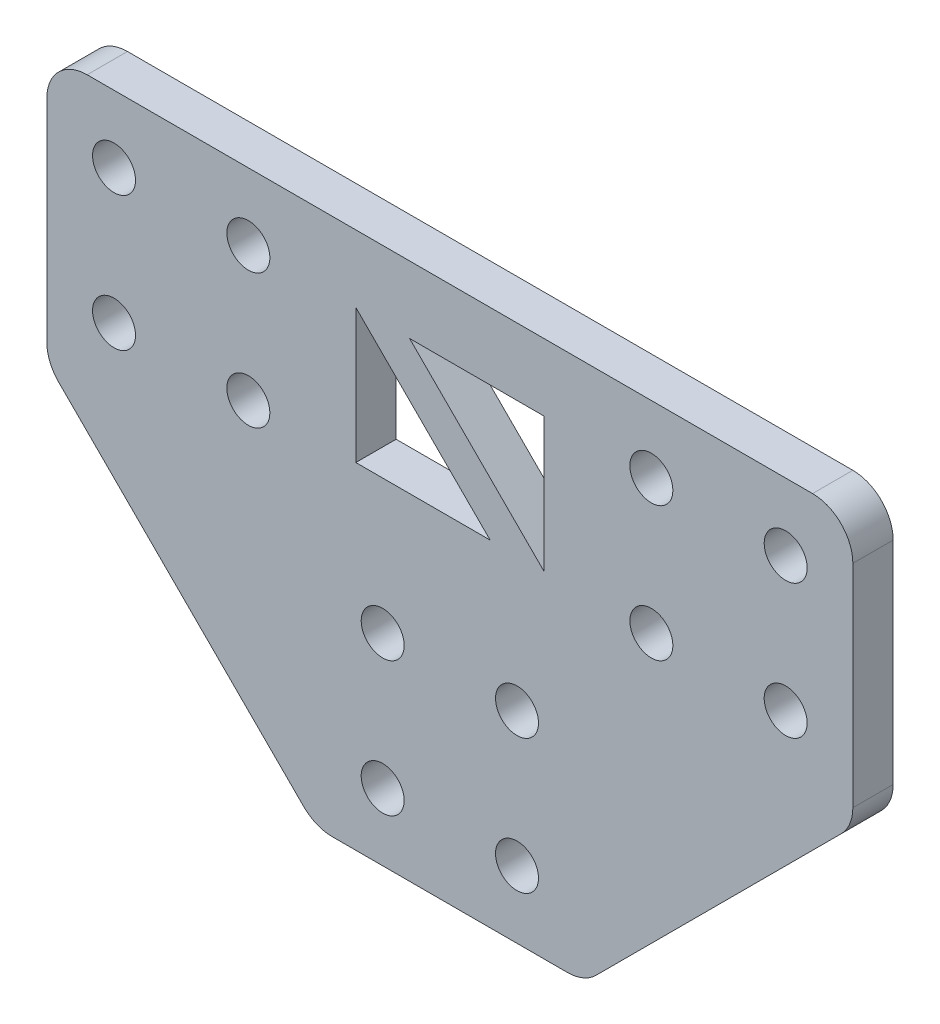
ISO-10303-21;
HEADER;
FILE_DESCRIPTION(('STEP AP214'),'2;1');
FILE_NAME('part.step','',(''),(''),'','','');
FILE_SCHEMA(('AUTOMOTIVE_DESIGN { 1 0 10303 214 1 1 1 1 }'));
ENDSEC;
DATA;
#1=APPLICATION_CONTEXT('core data for automotive mechanical design processes');
#2=APPLICATION_PROTOCOL_DEFINITION('international standard','automotive_design',2000,#1);
#3=PRODUCT_CONTEXT('',#1,'mechanical');
#4=PRODUCT('Part','Part','',(#3));
#5=PRODUCT_RELATED_PRODUCT_CATEGORY('part','',(#4));
#6=PRODUCT_DEFINITION_FORMATION('','',#4);
#7=PRODUCT_DEFINITION_CONTEXT('part definition',#1,'design');
#8=PRODUCT_DEFINITION('design','',#6,#7);
#9=PRODUCT_DEFINITION_SHAPE('','',#8);
#10=(LENGTH_UNIT() NAMED_UNIT(*) SI_UNIT(.MILLI.,.METRE.));
#11=(NAMED_UNIT(*) PLANE_ANGLE_UNIT() SI_UNIT($,.RADIAN.));
#12=(NAMED_UNIT(*) SI_UNIT($,.STERADIAN.) SOLID_ANGLE_UNIT());
#13=UNCERTAINTY_MEASURE_WITH_UNIT(LENGTH_MEASURE(1.E-05),#10,'distance_accuracy_value','');
#14=(GEOMETRIC_REPRESENTATION_CONTEXT(3) GLOBAL_UNCERTAINTY_ASSIGNED_CONTEXT((#13)) GLOBAL_UNIT_ASSIGNED_CONTEXT((#10,
#11,#12)) REPRESENTATION_CONTEXT('',''));
#15=CARTESIAN_POINT('',(0.,0.,0.));
#16=DIRECTION('',(0.,0.,1.));
#17=DIRECTION('',(1.,0.,0.));
#18=AXIS2_PLACEMENT_3D('',#15,#16,#17);
#19=CARTESIAN_POINT('',(0.,0.,3.));
#20=DIRECTION('',(0.,0.,-1.));
#21=DIRECTION('',(-1.,0.,0.));
#22=AXIS2_PLACEMENT_3D('',#19,#20,#21);
#23=PLANE('',#22);
#24=DIRECTION('',(-0.707106781186548,0.707106781186547,0.));
#25=VECTOR('',#24,1.);
#26=CARTESIAN_POINT('',(33.,-15.,3.));
#27=LINE('',#26,#25);
#28=CARTESIAN_POINT('',(33.,-15.,3.));
#29=VERTEX_POINT('',#28);
#30=CARTESIAN_POINT('',(23.,-5.,3.));
#31=VERTEX_POINT('',#30);
#32=EDGE_CURVE('E211',#29,#31,#27,.T.);
#33=ORIENTED_EDGE('',*,*,#32,.F.);
#34=DIRECTION('',(1.,0.,0.));
#35=VECTOR('',#34,1.);
#36=CARTESIAN_POINT('',(23.,-15.,3.));
#37=LINE('',#36,#35);
#38=CARTESIAN_POINT('',(23.,-15.,3.));
#39=VERTEX_POINT('',#38);
#40=EDGE_CURVE('E219',#39,#29,#37,.T.);
#41=ORIENTED_EDGE('',*,*,#40,.F.);
#42=DIRECTION('',(0.,-1.,0.));
#43=VECTOR('',#42,1.);
#44=CARTESIAN_POINT('',(23.,-5.,3.));
#45=LINE('',#44,#43);
#46=EDGE_CURVE('E214',#31,#39,#45,.T.);
#47=ORIENTED_EDGE('',*,*,#46,.F.);
#48=EDGE_LOOP('',(#33,#41,#47));
#49=FACE_BOUND('',#48,.T.);
#50=DIRECTION('',(0.707106781186547,0.707106781186548,0.));
#51=VECTOR('',#50,1.);
#52=CARTESIAN_POINT('',(60.,-20.,3.));
#53=LINE('',#52,#51);
#54=CARTESIAN_POINT('',(40.8786796564404,-39.1213203435596,3.));
#55=VERTEX_POINT('',#54);
#56=CARTESIAN_POINT('',(59.1213203435596,-20.8786796564404,3.));
#57=VERTEX_POINT('',#56);
#58=EDGE_CURVE('E353',#55,#57,#53,.T.);
#59=ORIENTED_EDGE('',*,*,#58,.T.);
#60=CARTESIAN_POINT('',(57.,-18.7573593128807,3.));
#61=DIRECTION('',(0.,0.,-1.));
#62=DIRECTION('',(-1.,0.,0.));
#63=AXIS2_PLACEMENT_3D('',#60,#61,#62);
#64=CIRCLE('',#63,3.);
#65=CARTESIAN_POINT('',(60.,-18.7573593128807,3.));
#66=VERTEX_POINT('',#65);
#67=EDGE_CURVE('E430',#57,#66,#64,.F.);
#68=ORIENTED_EDGE('',*,*,#67,.T.);
#69=DIRECTION('',(0.,1.,0.));
#70=VECTOR('',#69,1.);
#71=CARTESIAN_POINT('',(60.,0.,3.));
#72=LINE('',#71,#70);
#73=CARTESIAN_POINT('',(60.,-3.,3.));
#74=VERTEX_POINT('',#73);
#75=EDGE_CURVE('E357',#66,#74,#72,.T.);
#76=ORIENTED_EDGE('',*,*,#75,.T.);
#77=CARTESIAN_POINT('',(57.,-3.,3.));
#78=DIRECTION('',(0.,0.,-1.));
#79=DIRECTION('',(-1.,0.,0.));
#80=AXIS2_PLACEMENT_3D('',#77,#78,#79);
#81=CIRCLE('',#80,3.);
#82=CARTESIAN_POINT('',(57.,0.,3.));
#83=VERTEX_POINT('',#82);
#84=EDGE_CURVE('E64',#74,#83,#81,.F.);
#85=ORIENTED_EDGE('',*,*,#84,.T.);
#86=DIRECTION('',(-1.,0.,0.));
#87=VECTOR('',#86,1.);
#88=CARTESIAN_POINT('',(0.,0.,3.));
#89=LINE('',#88,#87);
#90=CARTESIAN_POINT('',(3.,0.,3.));
#91=VERTEX_POINT('',#90);
#92=EDGE_CURVE('E360',#83,#91,#89,.T.);
#93=ORIENTED_EDGE('',*,*,#92,.T.);
#94=CARTESIAN_POINT('',(3.,-3.,3.));
#95=DIRECTION('',(0.,0.,-1.));
#96=DIRECTION('',(-1.,0.,0.));
#97=AXIS2_PLACEMENT_3D('',#94,#95,#96);
#98=CIRCLE('',#97,3.);
#99=CARTESIAN_POINT('',(0.,-3.,3.));
#100=VERTEX_POINT('',#99);
#101=EDGE_CURVE('E416',#91,#100,#98,.F.);
#102=ORIENTED_EDGE('',*,*,#101,.T.);
#103=DIRECTION('',(0.,-1.,0.));
#104=VECTOR('',#103,1.);
#105=CARTESIAN_POINT('',(0.,-20.,3.));
#106=LINE('',#105,#104);
#107=CARTESIAN_POINT('',(0.,-18.7573593128807,3.));
#108=VERTEX_POINT('',#107);
#109=EDGE_CURVE('E340',#100,#108,#106,.T.);
#110=ORIENTED_EDGE('',*,*,#109,.T.);
#111=CARTESIAN_POINT('',(3.,-18.7573593128807,3.));
#112=DIRECTION('',(0.,0.,-1.));
#113=DIRECTION('',(-1.,0.,0.));
#114=AXIS2_PLACEMENT_3D('',#111,#112,#113);
#115=CIRCLE('',#114,3.);
#116=CARTESIAN_POINT('',(0.878679656440354,-20.8786796564404,3.));
#117=VERTEX_POINT('',#116);
#118=EDGE_CURVE('E427',#108,#117,#115,.F.);
#119=ORIENTED_EDGE('',*,*,#118,.T.);
#120=DIRECTION('',(0.707106781186548,-0.707106781186548,0.));
#121=VECTOR('',#120,1.);
#122=CARTESIAN_POINT('',(20.,-40.,3.));
#123=LINE('',#122,#121);
#124=CARTESIAN_POINT('',(19.1213203435596,-39.1213203435596,3.));
#125=VERTEX_POINT('',#124);
#126=EDGE_CURVE('E344',#117,#125,#123,.T.);
#127=ORIENTED_EDGE('',*,*,#126,.T.);
#128=CARTESIAN_POINT('',(21.2426406871193,-37.,3.));
#129=DIRECTION('',(0.,0.,-1.));
#130=DIRECTION('',(-1.,0.,0.));
#131=AXIS2_PLACEMENT_3D('',#128,#129,#130);
#132=CIRCLE('',#131,3.);
#133=CARTESIAN_POINT('',(21.2426406871193,-40.,3.));
#134=VERTEX_POINT('',#133);
#135=EDGE_CURVE('E424',#125,#134,#132,.F.);
#136=ORIENTED_EDGE('',*,*,#135,.T.);
#137=DIRECTION('',(1.,0.,0.));
#138=VECTOR('',#137,1.);
#139=CARTESIAN_POINT('',(40.,-40.,3.));
#140=LINE('',#139,#138);
#141=CARTESIAN_POINT('',(38.7573593128807,-40.,3.));
#142=VERTEX_POINT('',#141);
#143=EDGE_CURVE('E349',#134,#142,#140,.T.);
#144=ORIENTED_EDGE('',*,*,#143,.T.);
#145=CARTESIAN_POINT('',(38.7573593128807,-37.,3.));
#146=DIRECTION('',(0.,0.,-1.));
#147=DIRECTION('',(-1.,0.,0.));
#148=AXIS2_PLACEMENT_3D('',#145,#146,#147);
#149=CIRCLE('',#148,3.);
#150=EDGE_CURVE('E421',#142,#55,#149,.F.);
#151=ORIENTED_EDGE('',*,*,#150,.T.);
#152=EDGE_LOOP('',(#59,#68,#76,#85,#93,#102,#110,#119,#127,#136,#144,#151));
#153=FACE_BOUND('',#152,.T.);
#154=CARTESIAN_POINT('',(5.,-5.,3.));
#155=DIRECTION('',(0.,0.,1.));
#156=DIRECTION('',(1.,0.,0.));
#157=AXIS2_PLACEMENT_3D('',#154,#155,#156);
#158=CIRCLE('',#157,1.6);
#159=CARTESIAN_POINT('',(6.6,-5.,3.));
#160=VERTEX_POINT('',#159);
#161=EDGE_CURVE('E332',#160,#160,#158,.T.);
#162=ORIENTED_EDGE('',*,*,#161,.F.);
#163=EDGE_LOOP('',(#162));
#164=FACE_BOUND('',#163,.T.);
#165=CARTESIAN_POINT('',(15.,-5.,3.));
#166=DIRECTION('',(0.,0.,1.));
#167=DIRECTION('',(-1.,0.,0.));
#168=AXIS2_PLACEMENT_3D('',#165,#166,#167);
#169=CIRCLE('',#168,1.6);
#170=CARTESIAN_POINT('',(13.4,-5.,3.));
#171=VERTEX_POINT('',#170);
#172=EDGE_CURVE('E324',#171,#171,#169,.T.);
#173=ORIENTED_EDGE('',*,*,#172,.F.);
#174=EDGE_LOOP('',(#173));
#175=FACE_BOUND('',#174,.T.);
#176=CARTESIAN_POINT('',(15.,-15.,3.));
#177=DIRECTION('',(0.,0.,1.));
#178=DIRECTION('',(1.,0.,0.));
#179=AXIS2_PLACEMENT_3D('',#176,#177,#178);
#180=CIRCLE('',#179,1.6);
#181=CARTESIAN_POINT('',(16.6,-15.,3.));
#182=VERTEX_POINT('',#181);
#183=EDGE_CURVE('E316',#182,#182,#180,.T.);
#184=ORIENTED_EDGE('',*,*,#183,.F.);
#185=EDGE_LOOP('',(#184));
#186=FACE_BOUND('',#185,.T.);
#187=CARTESIAN_POINT('',(5.,-15.,3.));
#188=DIRECTION('',(0.,0.,1.));
#189=DIRECTION('',(-1.,0.,0.));
#190=AXIS2_PLACEMENT_3D('',#187,#188,#189);
#191=CIRCLE('',#190,1.6);
#192=CARTESIAN_POINT('',(3.4,-15.,3.));
#193=VERTEX_POINT('',#192);
#194=EDGE_CURVE('E308',#193,#193,#191,.T.);
#195=ORIENTED_EDGE('',*,*,#194,.F.);
#196=EDGE_LOOP('',(#195));
#197=FACE_BOUND('',#196,.T.);
#198=CARTESIAN_POINT('',(55.,-15.,3.));
#199=DIRECTION('',(0.,0.,1.));
#200=DIRECTION('',(1.,0.,0.));
#201=AXIS2_PLACEMENT_3D('',#198,#199,#200);
#202=CIRCLE('',#201,1.59999999999999);
#203=CARTESIAN_POINT('',(56.6,-15.,3.));
#204=VERTEX_POINT('',#203);
#205=EDGE_CURVE('E300',#204,#204,#202,.T.);
#206=ORIENTED_EDGE('',*,*,#205,.F.);
#207=EDGE_LOOP('',(#206));
#208=FACE_BOUND('',#207,.T.);
#209=CARTESIAN_POINT('',(45.,-15.,3.));
#210=DIRECTION('',(0.,0.,1.));
#211=DIRECTION('',(-1.,0.,0.));
#212=AXIS2_PLACEMENT_3D('',#209,#210,#211);
#213=CIRCLE('',#212,1.6);
#214=CARTESIAN_POINT('',(43.4,-15.,3.));
#215=VERTEX_POINT('',#214);
#216=EDGE_CURVE('E292',#215,#215,#213,.T.);
#217=ORIENTED_EDGE('',*,*,#216,.F.);
#218=EDGE_LOOP('',(#217));
#219=FACE_BOUND('',#218,.T.);
#220=CARTESIAN_POINT('',(45.,-4.99999999999999,3.));
#221=DIRECTION('',(0.,0.,1.));
#222=DIRECTION('',(1.,0.,0.));
#223=AXIS2_PLACEMENT_3D('',#220,#221,#222);
#224=CIRCLE('',#223,1.6);
#225=CARTESIAN_POINT('',(46.6,-4.99999999999999,3.));
#226=VERTEX_POINT('',#225);
#227=EDGE_CURVE('E284',#226,#226,#224,.T.);
#228=ORIENTED_EDGE('',*,*,#227,.F.);
#229=EDGE_LOOP('',(#228));
#230=FACE_BOUND('',#229,.T.);
#231=CARTESIAN_POINT('',(55.,-4.99999999999999,3.));
#232=DIRECTION('',(0.,0.,1.));
#233=DIRECTION('',(-1.,0.,0.));
#234=AXIS2_PLACEMENT_3D('',#231,#232,#233);
#235=CIRCLE('',#234,1.59999999999999);
#236=CARTESIAN_POINT('',(53.4,-4.99999999999999,3.));
#237=VERTEX_POINT('',#236);
#238=EDGE_CURVE('E276',#237,#237,#235,.T.);
#239=ORIENTED_EDGE('',*,*,#238,.F.);
#240=EDGE_LOOP('',(#239));
#241=FACE_BOUND('',#240,.T.);
#242=CARTESIAN_POINT('',(25.,-35.,3.));
#243=DIRECTION('',(0.,0.,1.));
#244=DIRECTION('',(1.,0.,0.));
#245=AXIS2_PLACEMENT_3D('',#242,#243,#244);
#246=CIRCLE('',#245,1.6);
#247=CARTESIAN_POINT('',(26.6,-35.,3.));
#248=VERTEX_POINT('',#247);
#249=EDGE_CURVE('E268',#248,#248,#246,.T.);
#250=ORIENTED_EDGE('',*,*,#249,.F.);
#251=EDGE_LOOP('',(#250));
#252=FACE_BOUND('',#251,.T.);
#253=CARTESIAN_POINT('',(35.,-35.,3.));
#254=DIRECTION('',(0.,0.,1.));
#255=DIRECTION('',(-1.,0.,0.));
#256=AXIS2_PLACEMENT_3D('',#253,#254,#255);
#257=CIRCLE('',#256,1.6);
#258=CARTESIAN_POINT('',(33.4,-35.,3.));
#259=VERTEX_POINT('',#258);
#260=EDGE_CURVE('E260',#259,#259,#257,.T.);
#261=ORIENTED_EDGE('',*,*,#260,.F.);
#262=EDGE_LOOP('',(#261));
#263=FACE_BOUND('',#262,.T.);
#264=CARTESIAN_POINT('',(35.,-25.,3.));
#265=DIRECTION('',(0.,0.,1.));
#266=DIRECTION('',(1.,0.,0.));
#267=AXIS2_PLACEMENT_3D('',#264,#265,#266);
#268=CIRCLE('',#267,1.6);
#269=CARTESIAN_POINT('',(36.6,-25.,3.));
#270=VERTEX_POINT('',#269);
#271=EDGE_CURVE('E252',#270,#270,#268,.T.);
#272=ORIENTED_EDGE('',*,*,#271,.F.);
#273=EDGE_LOOP('',(#272));
#274=FACE_BOUND('',#273,.T.);
#275=CARTESIAN_POINT('',(25.,-25.,3.));
#276=DIRECTION('',(0.,0.,1.));
#277=DIRECTION('',(-1.,0.,0.));
#278=AXIS2_PLACEMENT_3D('',#275,#276,#277);
#279=CIRCLE('',#278,1.6);
#280=CARTESIAN_POINT('',(23.4,-25.,3.));
#281=VERTEX_POINT('',#280);
#282=EDGE_CURVE('E244',#281,#281,#279,.T.);
#283=ORIENTED_EDGE('',*,*,#282,.F.);
#284=EDGE_LOOP('',(#283));
#285=FACE_BOUND('',#284,.T.);
#286=DIRECTION('',(0.707106781186547,-0.707106781186548,0.));
#287=VECTOR('',#286,1.);
#288=CARTESIAN_POINT('',(37.,-15.,3.));
#289=LINE('',#288,#287);
#290=CARTESIAN_POINT('',(27.,-5.,3.));
#291=VERTEX_POINT('',#290);
#292=CARTESIAN_POINT('',(37.,-15.,3.));
#293=VERTEX_POINT('',#292);
#294=EDGE_CURVE('E170',#291,#293,#289,.T.);
#295=ORIENTED_EDGE('',*,*,#294,.F.);
#296=DIRECTION('',(-1.,0.,0.));
#297=VECTOR('',#296,1.);
#298=CARTESIAN_POINT('',(27.,-5.,3.));
#299=LINE('',#298,#297);
#300=CARTESIAN_POINT('',(37.,-5.,3.));
#301=VERTEX_POINT('',#300);
#302=EDGE_CURVE('E193',#301,#291,#299,.T.);
#303=ORIENTED_EDGE('',*,*,#302,.F.);
#304=DIRECTION('',(0.,1.,0.));
#305=VECTOR('',#304,1.);
#306=CARTESIAN_POINT('',(37.,-5.,3.));
#307=LINE('',#306,#305);
#308=EDGE_CURVE('E181',#293,#301,#307,.T.);
#309=ORIENTED_EDGE('',*,*,#308,.F.);
#310=EDGE_LOOP('',(#295,#303,#309));
#311=FACE_BOUND('',#310,.T.);
#312=ADVANCED_FACE('F42',(#49,#153,#164,#175,#186,#197,#208,#219,#230,#241,#252,#263,#274,#285,
#311),#23,.F.);
#313=CARTESIAN_POINT('',(0.,0.,0.));
#314=DIRECTION('',(0.,0.,-1.));
#315=DIRECTION('',(-1.,0.,0.));
#316=AXIS2_PLACEMENT_3D('',#313,#314,#315);
#317=PLANE('',#316);
#318=CARTESIAN_POINT('',(35.,-25.,0.));
#319=DIRECTION('',(0.,0.,1.));
#320=DIRECTION('',(1.,0.,0.));
#321=AXIS2_PLACEMENT_3D('',#318,#319,#320);
#322=CIRCLE('',#321,1.6);
#323=CARTESIAN_POINT('',(36.6,-25.,0.));
#324=VERTEX_POINT('',#323);
#325=EDGE_CURVE('E248',#324,#324,#322,.T.);
#326=ORIENTED_EDGE('',*,*,#325,.T.);
#327=EDGE_LOOP('',(#326));
#328=FACE_BOUND('',#327,.T.);
#329=CARTESIAN_POINT('',(25.,-35.,0.));
#330=DIRECTION('',(0.,0.,1.));
#331=DIRECTION('',(1.,0.,0.));
#332=AXIS2_PLACEMENT_3D('',#329,#330,#331);
#333=CIRCLE('',#332,1.6);
#334=CARTESIAN_POINT('',(26.6,-35.,0.));
#335=VERTEX_POINT('',#334);
#336=EDGE_CURVE('E264',#335,#335,#333,.T.);
#337=ORIENTED_EDGE('',*,*,#336,.T.);
#338=EDGE_LOOP('',(#337));
#339=FACE_BOUND('',#338,.T.);
#340=CARTESIAN_POINT('',(45.,-4.99999999999999,0.));
#341=DIRECTION('',(0.,0.,1.));
#342=DIRECTION('',(1.,0.,0.));
#343=AXIS2_PLACEMENT_3D('',#340,#341,#342);
#344=CIRCLE('',#343,1.6);
#345=CARTESIAN_POINT('',(46.6,-4.99999999999999,0.));
#346=VERTEX_POINT('',#345);
#347=EDGE_CURVE('E280',#346,#346,#344,.T.);
#348=ORIENTED_EDGE('',*,*,#347,.T.);
#349=EDGE_LOOP('',(#348));
#350=FACE_BOUND('',#349,.T.);
#351=CARTESIAN_POINT('',(55.,-15.,0.));
#352=DIRECTION('',(0.,0.,1.));
#353=DIRECTION('',(1.,0.,0.));
#354=AXIS2_PLACEMENT_3D('',#351,#352,#353);
#355=CIRCLE('',#354,1.59999999999999);
#356=CARTESIAN_POINT('',(56.6,-15.,0.));
#357=VERTEX_POINT('',#356);
#358=EDGE_CURVE('E296',#357,#357,#355,.T.);
#359=ORIENTED_EDGE('',*,*,#358,.T.);
#360=EDGE_LOOP('',(#359));
#361=FACE_BOUND('',#360,.T.);
#362=CARTESIAN_POINT('',(15.,-15.,0.));
#363=DIRECTION('',(0.,0.,1.));
#364=DIRECTION('',(1.,0.,0.));
#365=AXIS2_PLACEMENT_3D('',#362,#363,#364);
#366=CIRCLE('',#365,1.6);
#367=CARTESIAN_POINT('',(16.6,-15.,0.));
#368=VERTEX_POINT('',#367);
#369=EDGE_CURVE('E312',#368,#368,#366,.T.);
#370=ORIENTED_EDGE('',*,*,#369,.T.);
#371=EDGE_LOOP('',(#370));
#372=FACE_BOUND('',#371,.T.);
#373=CARTESIAN_POINT('',(5.,-5.,0.));
#374=DIRECTION('',(0.,0.,1.));
#375=DIRECTION('',(1.,0.,0.));
#376=AXIS2_PLACEMENT_3D('',#373,#374,#375);
#377=CIRCLE('',#376,1.6);
#378=CARTESIAN_POINT('',(6.6,-5.,0.));
#379=VERTEX_POINT('',#378);
#380=EDGE_CURVE('E328',#379,#379,#377,.T.);
#381=ORIENTED_EDGE('',*,*,#380,.T.);
#382=EDGE_LOOP('',(#381));
#383=FACE_BOUND('',#382,.T.);
#384=DIRECTION('',(0.,1.,0.));
#385=VECTOR('',#384,1.);
#386=CARTESIAN_POINT('',(60.,0.,0.));
#387=LINE('',#386,#385);
#388=CARTESIAN_POINT('',(60.,-18.7573593128807,0.));
#389=VERTEX_POINT('',#388);
#390=CARTESIAN_POINT('',(60.,-3.,0.));
#391=VERTEX_POINT('',#390);
#392=EDGE_CURVE('E379',#389,#391,#387,.T.);
#393=ORIENTED_EDGE('',*,*,#392,.F.);
#394=CARTESIAN_POINT('',(57.,-18.7573593128807,0.));
#395=DIRECTION('',(0.,0.,-1.));
#396=DIRECTION('',(-1.,0.,0.));
#397=AXIS2_PLACEMENT_3D('',#394,#395,#396);
#398=CIRCLE('',#397,3.);
#399=CARTESIAN_POINT('',(59.1213203435596,-20.8786796564404,0.));
#400=VERTEX_POINT('',#399);
#401=EDGE_CURVE('E406',#389,#400,#398,.T.);
#402=ORIENTED_EDGE('',*,*,#401,.T.);
#403=DIRECTION('',(0.707106781186547,0.707106781186548,0.));
#404=VECTOR('',#403,1.);
#405=CARTESIAN_POINT('',(60.,-20.,0.));
#406=LINE('',#405,#404);
#407=CARTESIAN_POINT('',(40.8786796564404,-39.1213203435596,0.));
#408=VERTEX_POINT('',#407);
#409=EDGE_CURVE('E375',#408,#400,#406,.T.);
#410=ORIENTED_EDGE('',*,*,#409,.F.);
#411=CARTESIAN_POINT('',(38.7573593128807,-37.,0.));
#412=DIRECTION('',(0.,0.,-1.));
#413=DIRECTION('',(-1.,0.,0.));
#414=AXIS2_PLACEMENT_3D('',#411,#412,#413);
#415=CIRCLE('',#414,3.);
#416=CARTESIAN_POINT('',(38.7573593128807,-40.,0.));
#417=VERTEX_POINT('',#416);
#418=EDGE_CURVE('E397',#408,#417,#415,.T.);
#419=ORIENTED_EDGE('',*,*,#418,.T.);
#420=DIRECTION('',(1.,0.,0.));
#421=VECTOR('',#420,1.);
#422=CARTESIAN_POINT('',(40.,-40.,0.));
#423=LINE('',#422,#421);
#424=CARTESIAN_POINT('',(21.2426406871193,-40.,0.));
#425=VERTEX_POINT('',#424);
#426=EDGE_CURVE('E371',#425,#417,#423,.T.);
#427=ORIENTED_EDGE('',*,*,#426,.F.);
#428=CARTESIAN_POINT('',(21.2426406871193,-37.,0.));
#429=DIRECTION('',(0.,0.,-1.));
#430=DIRECTION('',(-1.,0.,0.));
#431=AXIS2_PLACEMENT_3D('',#428,#429,#430);
#432=CIRCLE('',#431,3.);
#433=CARTESIAN_POINT('',(19.1213203435596,-39.1213203435596,0.));
#434=VERTEX_POINT('',#433);
#435=EDGE_CURVE('E400',#425,#434,#432,.T.);
#436=ORIENTED_EDGE('',*,*,#435,.T.);
#437=DIRECTION('',(0.707106781186548,-0.707106781186548,0.));
#438=VECTOR('',#437,1.);
#439=CARTESIAN_POINT('',(20.,-40.,0.));
#440=LINE('',#439,#438);
#441=CARTESIAN_POINT('',(0.878679656440354,-20.8786796564404,0.));
#442=VERTEX_POINT('',#441);
#443=EDGE_CURVE('E367',#442,#434,#440,.T.);
#444=ORIENTED_EDGE('',*,*,#443,.F.);
#445=CARTESIAN_POINT('',(3.,-18.7573593128807,0.));
#446=DIRECTION('',(0.,0.,-1.));
#447=DIRECTION('',(-1.,0.,0.));
#448=AXIS2_PLACEMENT_3D('',#445,#446,#447);
#449=CIRCLE('',#448,3.);
#450=CARTESIAN_POINT('',(0.,-18.7573593128807,0.));
#451=VERTEX_POINT('',#450);
#452=EDGE_CURVE('E403',#442,#451,#449,.T.);
#453=ORIENTED_EDGE('',*,*,#452,.T.);
#454=DIRECTION('',(0.,-1.,0.));
#455=VECTOR('',#454,1.);
#456=CARTESIAN_POINT('',(0.,-20.,0.));
#457=LINE('',#456,#455);
#458=CARTESIAN_POINT('',(0.,-3.,0.));
#459=VERTEX_POINT('',#458);
#460=EDGE_CURVE('E336',#459,#451,#457,.T.);
#461=ORIENTED_EDGE('',*,*,#460,.F.);
#462=CARTESIAN_POINT('',(3.,-3.,0.));
#463=DIRECTION('',(0.,0.,-1.));
#464=DIRECTION('',(-1.,0.,0.));
#465=AXIS2_PLACEMENT_3D('',#462,#463,#464);
#466=CIRCLE('',#465,3.);
#467=CARTESIAN_POINT('',(3.,0.,0.));
#468=VERTEX_POINT('',#467);
#469=EDGE_CURVE('E391',#459,#468,#466,.T.);
#470=ORIENTED_EDGE('',*,*,#469,.T.);
#471=DIRECTION('',(-1.,0.,0.));
#472=VECTOR('',#471,1.);
#473=CARTESIAN_POINT('',(0.,0.,0.));
#474=LINE('',#473,#472);
#475=CARTESIAN_POINT('',(57.,0.,0.));
#476=VERTEX_POINT('',#475);
#477=EDGE_CURVE('E345',#476,#468,#474,.T.);
#478=ORIENTED_EDGE('',*,*,#477,.F.);
#479=CARTESIAN_POINT('',(57.,-3.,0.));
#480=DIRECTION('',(0.,0.,-1.));
#481=DIRECTION('',(-1.,0.,0.));
#482=AXIS2_PLACEMENT_3D('',#479,#480,#481);
#483=CIRCLE('',#482,3.);
#484=EDGE_CURVE('E394',#476,#391,#483,.T.);
#485=ORIENTED_EDGE('',*,*,#484,.T.);
#486=EDGE_LOOP('',(#393,#402,#410,#419,#427,#436,#444,#453,#461,#470,#478,#485));
#487=FACE_BOUND('',#486,.T.);
#488=CARTESIAN_POINT('',(15.,-5.,0.));
#489=DIRECTION('',(0.,0.,1.));
#490=DIRECTION('',(-1.,0.,0.));
#491=AXIS2_PLACEMENT_3D('',#488,#489,#490);
#492=CIRCLE('',#491,1.6);
#493=CARTESIAN_POINT('',(13.4,-5.,0.));
#494=VERTEX_POINT('',#493);
#495=EDGE_CURVE('E320',#494,#494,#492,.T.);
#496=ORIENTED_EDGE('',*,*,#495,.T.);
#497=EDGE_LOOP('',(#496));
#498=FACE_BOUND('',#497,.T.);
#499=CARTESIAN_POINT('',(5.,-15.,0.));
#500=DIRECTION('',(0.,0.,1.));
#501=DIRECTION('',(-1.,0.,0.));
#502=AXIS2_PLACEMENT_3D('',#499,#500,#501);
#503=CIRCLE('',#502,1.6);
#504=CARTESIAN_POINT('',(3.4,-15.,0.));
#505=VERTEX_POINT('',#504);
#506=EDGE_CURVE('E304',#505,#505,#503,.T.);
#507=ORIENTED_EDGE('',*,*,#506,.T.);
#508=EDGE_LOOP('',(#507));
#509=FACE_BOUND('',#508,.T.);
#510=CARTESIAN_POINT('',(45.,-15.,0.));
#511=DIRECTION('',(0.,0.,1.));
#512=DIRECTION('',(-1.,0.,0.));
#513=AXIS2_PLACEMENT_3D('',#510,#511,#512);
#514=CIRCLE('',#513,1.6);
#515=CARTESIAN_POINT('',(43.4,-15.,0.));
#516=VERTEX_POINT('',#515);
#517=EDGE_CURVE('E288',#516,#516,#514,.T.);
#518=ORIENTED_EDGE('',*,*,#517,.T.);
#519=EDGE_LOOP('',(#518));
#520=FACE_BOUND('',#519,.T.);
#521=CARTESIAN_POINT('',(55.,-4.99999999999999,0.));
#522=DIRECTION('',(0.,0.,1.));
#523=DIRECTION('',(-1.,0.,0.));
#524=AXIS2_PLACEMENT_3D('',#521,#522,#523);
#525=CIRCLE('',#524,1.59999999999999);
#526=CARTESIAN_POINT('',(53.4,-4.99999999999999,0.));
#527=VERTEX_POINT('',#526);
#528=EDGE_CURVE('E272',#527,#527,#525,.T.);
#529=ORIENTED_EDGE('',*,*,#528,.T.);
#530=EDGE_LOOP('',(#529));
#531=FACE_BOUND('',#530,.T.);
#532=CARTESIAN_POINT('',(35.,-35.,0.));
#533=DIRECTION('',(0.,0.,1.));
#534=DIRECTION('',(-1.,0.,0.));
#535=AXIS2_PLACEMENT_3D('',#532,#533,#534);
#536=CIRCLE('',#535,1.6);
#537=CARTESIAN_POINT('',(33.4,-35.,0.));
#538=VERTEX_POINT('',#537);
#539=EDGE_CURVE('E256',#538,#538,#536,.T.);
#540=ORIENTED_EDGE('',*,*,#539,.T.);
#541=EDGE_LOOP('',(#540));
#542=FACE_BOUND('',#541,.T.);
#543=CARTESIAN_POINT('',(25.,-25.,0.));
#544=DIRECTION('',(0.,0.,1.));
#545=DIRECTION('',(-1.,0.,0.));
#546=AXIS2_PLACEMENT_3D('',#543,#544,#545);
#547=CIRCLE('',#546,1.6);
#548=CARTESIAN_POINT('',(23.4,-25.,0.));
#549=VERTEX_POINT('',#548);
#550=EDGE_CURVE('E243',#549,#549,#547,.T.);
#551=ORIENTED_EDGE('',*,*,#550,.T.);
#552=EDGE_LOOP('',(#551));
#553=FACE_BOUND('',#552,.T.);
#554=DIRECTION('',(1.,0.,0.));
#555=VECTOR('',#554,1.);
#556=CARTESIAN_POINT('',(23.,-15.,0.));
#557=LINE('',#556,#555);
#558=CARTESIAN_POINT('',(23.,-15.,0.));
#559=VERTEX_POINT('',#558);
#560=CARTESIAN_POINT('',(33.,-15.,0.));
#561=VERTEX_POINT('',#560);
#562=EDGE_CURVE('E215',#559,#561,#557,.T.);
#563=ORIENTED_EDGE('',*,*,#562,.T.);
#564=DIRECTION('',(-0.707106781186548,0.707106781186547,0.));
#565=VECTOR('',#564,1.);
#566=CARTESIAN_POINT('',(33.,-15.,0.));
#567=LINE('',#566,#565);
#568=CARTESIAN_POINT('',(23.,-5.,0.));
#569=VERTEX_POINT('',#568);
#570=EDGE_CURVE('E190',#561,#569,#567,.T.);
#571=ORIENTED_EDGE('',*,*,#570,.T.);
#572=DIRECTION('',(0.,-1.,0.));
#573=VECTOR('',#572,1.);
#574=CARTESIAN_POINT('',(23.,-5.,0.));
#575=LINE('',#574,#573);
#576=EDGE_CURVE('E226',#569,#559,#575,.T.);
#577=ORIENTED_EDGE('',*,*,#576,.T.);
#578=EDGE_LOOP('',(#563,#571,#577));
#579=FACE_BOUND('',#578,.T.);
#580=DIRECTION('',(-1.,0.,0.));
#581=VECTOR('',#580,1.);
#582=CARTESIAN_POINT('',(27.,-5.,0.));
#583=LINE('',#582,#581);
#584=CARTESIAN_POINT('',(37.,-5.,0.));
#585=VERTEX_POINT('',#584);
#586=CARTESIAN_POINT('',(27.,-5.,0.));
#587=VERTEX_POINT('',#586);
#588=EDGE_CURVE('E182',#585,#587,#583,.T.);
#589=ORIENTED_EDGE('',*,*,#588,.T.);
#590=DIRECTION('',(0.707106781186547,-0.707106781186548,0.));
#591=VECTOR('',#590,1.);
#592=CARTESIAN_POINT('',(37.,-15.,0.));
#593=LINE('',#592,#591);
#594=CARTESIAN_POINT('',(37.,-15.,0.));
#595=VERTEX_POINT('',#594);
#596=EDGE_CURVE('E199',#587,#595,#593,.T.);
#597=ORIENTED_EDGE('',*,*,#596,.T.);
#598=DIRECTION('',(0.,1.,0.));
#599=VECTOR('',#598,1.);
#600=CARTESIAN_POINT('',(37.,-5.,0.));
#601=LINE('',#600,#599);
#602=EDGE_CURVE('E188',#595,#585,#601,.T.);
#603=ORIENTED_EDGE('',*,*,#602,.T.);
#604=EDGE_LOOP('',(#589,#597,#603));
#605=FACE_BOUND('',#604,.T.);
#606=ADVANCED_FACE('F464',(#328,#339,#350,#361,#372,#383,#487,#498,#509,#520,#531,#542,#553,
#579,#605),#317,.T.);
#607=CARTESIAN_POINT('',(0.,-20.,3.));
#608=DIRECTION('',(1.,0.,0.));
#609=DIRECTION('',(0.,0.,-1.));
#610=AXIS2_PLACEMENT_3D('',#607,#608,#609);
#611=PLANE('',#610);
#612=ORIENTED_EDGE('',*,*,#460,.T.);
#613=DIRECTION('',(0.,0.,-1.));
#614=VECTOR('',#613,1.);
#615=CARTESIAN_POINT('',(0.,-18.7573593128807,3.));
#616=LINE('',#615,#614);
#617=EDGE_CURVE('E444',#451,#108,#616,.F.);
#618=ORIENTED_EDGE('',*,*,#617,.T.);
#619=ORIENTED_EDGE('',*,*,#109,.F.);
#620=DIRECTION('',(0.,0.,-1.));
#621=VECTOR('',#620,1.);
#622=CARTESIAN_POINT('',(0.,-3.,3.));
#623=LINE('',#622,#621);
#624=EDGE_CURVE('E440',#100,#459,#623,.T.);
#625=ORIENTED_EDGE('',*,*,#624,.T.);
#626=EDGE_LOOP('',(#612,#618,#619,#625));
#627=FACE_BOUND('',#626,.T.);
#628=ADVANCED_FACE('F496',(#627),#611,.F.);
#629=CARTESIAN_POINT('',(20.,-40.,3.));
#630=DIRECTION('',(0.707106781186547,0.707106781186547,0.));
#631=DIRECTION('',(-0.707106781186548,0.707106781186548,0.));
#632=AXIS2_PLACEMENT_3D('',#629,#630,#631);
#633=PLANE('',#632);
#634=ORIENTED_EDGE('',*,*,#126,.F.);
#635=DIRECTION('',(0.,0.,-1.));
#636=VECTOR('',#635,1.);
#637=CARTESIAN_POINT('',(0.878679656440357,-20.8786796564404,3.));
#638=LINE('',#637,#636);
#639=EDGE_CURVE('E436',#117,#442,#638,.T.);
#640=ORIENTED_EDGE('',*,*,#639,.T.);
#641=ORIENTED_EDGE('',*,*,#443,.T.);
#642=DIRECTION('',(0.,0.,-1.));
#643=VECTOR('',#642,1.);
#644=CARTESIAN_POINT('',(19.1213203435596,-39.1213203435596,3.));
#645=LINE('',#644,#643);
#646=EDGE_CURVE('E433',#434,#125,#645,.F.);
#647=ORIENTED_EDGE('',*,*,#646,.T.);
#648=EDGE_LOOP('',(#634,#640,#641,#647));
#649=FACE_BOUND('',#648,.T.);
#650=ADVANCED_FACE('F504',(#649),#633,.F.);
#651=CARTESIAN_POINT('',(40.,-40.,3.));
#652=DIRECTION('',(0.,1.,0.));
#653=DIRECTION('',(0.,0.,1.));
#654=AXIS2_PLACEMENT_3D('',#651,#652,#653);
#655=PLANE('',#654);
#656=ORIENTED_EDGE('',*,*,#143,.F.);
#657=DIRECTION('',(0.,0.,-1.));
#658=VECTOR('',#657,1.);
#659=CARTESIAN_POINT('',(21.2426406871193,-40.,3.));
#660=LINE('',#659,#658);
#661=EDGE_CURVE('E450',#134,#425,#660,.T.);
#662=ORIENTED_EDGE('',*,*,#661,.T.);
#663=ORIENTED_EDGE('',*,*,#426,.T.);
#664=DIRECTION('',(0.,0.,-1.));
#665=VECTOR('',#664,1.);
#666=CARTESIAN_POINT('',(38.7573593128807,-40.,3.));
#667=LINE('',#666,#665);
#668=EDGE_CURVE('E447',#417,#142,#667,.F.);
#669=ORIENTED_EDGE('',*,*,#668,.T.);
#670=EDGE_LOOP('',(#656,#662,#663,#669));
#671=FACE_BOUND('',#670,.T.);
#672=ADVANCED_FACE('F458',(#671),#655,.F.);
#673=CARTESIAN_POINT('',(60.,-20.,3.));
#674=DIRECTION('',(-0.707106781186548,0.707106781186547,0.));
#675=DIRECTION('',(-0.707106781186547,-0.707106781186548,0.));
#676=AXIS2_PLACEMENT_3D('',#673,#674,#675);
#677=PLANE('',#676);
#678=ORIENTED_EDGE('',*,*,#409,.T.);
#679=DIRECTION('',(0.,0.,-1.));
#680=VECTOR('',#679,1.);
#681=CARTESIAN_POINT('',(59.1213203435596,-20.8786796564404,3.));
#682=LINE('',#681,#680);
#683=EDGE_CURVE('E413',#400,#57,#682,.F.);
#684=ORIENTED_EDGE('',*,*,#683,.T.);
#685=ORIENTED_EDGE('',*,*,#58,.F.);
#686=DIRECTION('',(0.,0.,-1.));
#687=VECTOR('',#686,1.);
#688=CARTESIAN_POINT('',(40.8786796564404,-39.1213203435596,3.));
#689=LINE('',#688,#687);
#690=EDGE_CURVE('E409',#55,#408,#689,.T.);
#691=ORIENTED_EDGE('',*,*,#690,.T.);
#692=EDGE_LOOP('',(#678,#684,#685,#691));
#693=FACE_BOUND('',#692,.T.);
#694=ADVANCED_FACE('F474',(#693),#677,.F.);
#695=CARTESIAN_POINT('',(60.,0.,3.));
#696=DIRECTION('',(-1.,0.,0.));
#697=DIRECTION('',(0.,0.,1.));
#698=AXIS2_PLACEMENT_3D('',#695,#696,#697);
#699=PLANE('',#698);
#700=ORIENTED_EDGE('',*,*,#75,.F.);
#701=DIRECTION('',(0.,0.,-1.));
#702=VECTOR('',#701,1.);
#703=CARTESIAN_POINT('',(60.,-18.7573593128807,3.));
#704=LINE('',#703,#702);
#705=EDGE_CURVE('E387',#66,#389,#704,.T.);
#706=ORIENTED_EDGE('',*,*,#705,.T.);
#707=ORIENTED_EDGE('',*,*,#392,.T.);
#708=DIRECTION('',(0.,0.,-1.));
#709=VECTOR('',#708,1.);
#710=CARTESIAN_POINT('',(60.,-3.,3.));
#711=LINE('',#710,#709);
#712=EDGE_CURVE('E363',#391,#74,#711,.F.);
#713=ORIENTED_EDGE('',*,*,#712,.T.);
#714=EDGE_LOOP('',(#700,#706,#707,#713));
#715=FACE_BOUND('',#714,.T.);
#716=ADVANCED_FACE('F483',(#715),#699,.F.);
#717=CARTESIAN_POINT('',(0.,0.,3.));
#718=DIRECTION('',(0.,-1.,0.));
#719=DIRECTION('',(0.,0.,-1.));
#720=AXIS2_PLACEMENT_3D('',#717,#718,#719);
#721=PLANE('',#720);
#722=ORIENTED_EDGE('',*,*,#92,.F.);
#723=DIRECTION('',(0.,0.,-1.));
#724=VECTOR('',#723,1.);
#725=CARTESIAN_POINT('',(57.,0.,3.));
#726=LINE('',#725,#724);
#727=EDGE_CURVE('E11',#83,#476,#726,.T.);
#728=ORIENTED_EDGE('',*,*,#727,.T.);
#729=ORIENTED_EDGE('',*,*,#477,.T.);
#730=DIRECTION('',(0.,0.,-1.));
#731=VECTOR('',#730,1.);
#732=CARTESIAN_POINT('',(3.,0.,3.));
#733=LINE('',#732,#731);
#734=EDGE_CURVE('E51',#468,#91,#733,.F.);
#735=ORIENTED_EDGE('',*,*,#734,.T.);
#736=EDGE_LOOP('',(#722,#728,#729,#735));
#737=FACE_BOUND('',#736,.T.);
#738=ADVANCED_FACE('F489',(#737),#721,.F.);
#739=CARTESIAN_POINT('',(5.,-5.,3.));
#740=DIRECTION('',(0.,0.,-1.));
#741=DIRECTION('',(-1.,0.,0.));
#742=AXIS2_PLACEMENT_3D('',#739,#740,#741);
#743=CYLINDRICAL_SURFACE('',#742,1.6);
#744=ORIENTED_EDGE('',*,*,#161,.T.);
#745=EDGE_LOOP('',(#744));
#746=FACE_BOUND('',#745,.T.);
#747=ORIENTED_EDGE('',*,*,#380,.F.);
#748=EDGE_LOOP('',(#747));
#749=FACE_BOUND('',#748,.T.);
#750=ADVANCED_FACE('F526',(#746,#749),#743,.F.);
#751=CARTESIAN_POINT('',(15.,-5.,3.));
#752=DIRECTION('',(0.,0.,-1.));
#753=DIRECTION('',(-1.,0.,0.));
#754=AXIS2_PLACEMENT_3D('',#751,#752,#753);
#755=CYLINDRICAL_SURFACE('',#754,1.6);
#756=ORIENTED_EDGE('',*,*,#172,.T.);
#757=EDGE_LOOP('',(#756));
#758=FACE_BOUND('',#757,.T.);
#759=ORIENTED_EDGE('',*,*,#495,.F.);
#760=EDGE_LOOP('',(#759));
#761=FACE_BOUND('',#760,.T.);
#762=ADVANCED_FACE('F605',(#758,#761),#755,.F.);
#763=CARTESIAN_POINT('',(15.,-15.,3.));
#764=DIRECTION('',(0.,0.,-1.));
#765=DIRECTION('',(-1.,0.,0.));
#766=AXIS2_PLACEMENT_3D('',#763,#764,#765);
#767=CYLINDRICAL_SURFACE('',#766,1.6);
#768=ORIENTED_EDGE('',*,*,#183,.T.);
#769=EDGE_LOOP('',(#768));
#770=FACE_BOUND('',#769,.T.);
#771=ORIENTED_EDGE('',*,*,#369,.F.);
#772=EDGE_LOOP('',(#771));
#773=FACE_BOUND('',#772,.T.);
#774=ADVANCED_FACE('F602',(#770,#773),#767,.F.);
#775=CARTESIAN_POINT('',(5.,-15.,3.));
#776=DIRECTION('',(0.,0.,-1.));
#777=DIRECTION('',(-1.,0.,0.));
#778=AXIS2_PLACEMENT_3D('',#775,#776,#777);
#779=CYLINDRICAL_SURFACE('',#778,1.6);
#780=ORIENTED_EDGE('',*,*,#194,.T.);
#781=EDGE_LOOP('',(#780));
#782=FACE_BOUND('',#781,.T.);
#783=ORIENTED_EDGE('',*,*,#506,.F.);
#784=EDGE_LOOP('',(#783));
#785=FACE_BOUND('',#784,.T.);
#786=ADVANCED_FACE('F598',(#782,#785),#779,.F.);
#787=CARTESIAN_POINT('',(55.,-15.,3.));
#788=DIRECTION('',(0.,0.,-1.));
#789=DIRECTION('',(-1.,0.,0.));
#790=AXIS2_PLACEMENT_3D('',#787,#788,#789);
#791=CYLINDRICAL_SURFACE('',#790,1.59999999999999);
#792=ORIENTED_EDGE('',*,*,#205,.T.);
#793=EDGE_LOOP('',(#792));
#794=FACE_BOUND('',#793,.T.);
#795=ORIENTED_EDGE('',*,*,#358,.F.);
#796=EDGE_LOOP('',(#795));
#797=FACE_BOUND('',#796,.T.);
#798=ADVANCED_FACE('F594',(#794,#797),#791,.F.);
#799=CARTESIAN_POINT('',(45.,-15.,3.));
#800=DIRECTION('',(0.,0.,-1.));
#801=DIRECTION('',(-1.,0.,0.));
#802=AXIS2_PLACEMENT_3D('',#799,#800,#801);
#803=CYLINDRICAL_SURFACE('',#802,1.6);
#804=ORIENTED_EDGE('',*,*,#216,.T.);
#805=EDGE_LOOP('',(#804));
#806=FACE_BOUND('',#805,.T.);
#807=ORIENTED_EDGE('',*,*,#517,.F.);
#808=EDGE_LOOP('',(#807));
#809=FACE_BOUND('',#808,.T.);
#810=ADVANCED_FACE('F590',(#806,#809),#803,.F.);
#811=CARTESIAN_POINT('',(45.,-4.99999999999999,3.));
#812=DIRECTION('',(0.,0.,-1.));
#813=DIRECTION('',(-1.,0.,0.));
#814=AXIS2_PLACEMENT_3D('',#811,#812,#813);
#815=CYLINDRICAL_SURFACE('',#814,1.6);
#816=ORIENTED_EDGE('',*,*,#227,.T.);
#817=EDGE_LOOP('',(#816));
#818=FACE_BOUND('',#817,.T.);
#819=ORIENTED_EDGE('',*,*,#347,.F.);
#820=EDGE_LOOP('',(#819));
#821=FACE_BOUND('',#820,.T.);
#822=ADVANCED_FACE('F586',(#818,#821),#815,.F.);
#823=CARTESIAN_POINT('',(55.,-4.99999999999999,3.));
#824=DIRECTION('',(0.,0.,-1.));
#825=DIRECTION('',(-1.,0.,0.));
#826=AXIS2_PLACEMENT_3D('',#823,#824,#825);
#827=CYLINDRICAL_SURFACE('',#826,1.59999999999999);
#828=ORIENTED_EDGE('',*,*,#238,.T.);
#829=EDGE_LOOP('',(#828));
#830=FACE_BOUND('',#829,.T.);
#831=ORIENTED_EDGE('',*,*,#528,.F.);
#832=EDGE_LOOP('',(#831));
#833=FACE_BOUND('',#832,.T.);
#834=ADVANCED_FACE('F582',(#830,#833),#827,.F.);
#835=CARTESIAN_POINT('',(25.,-35.,3.));
#836=DIRECTION('',(0.,0.,-1.));
#837=DIRECTION('',(-1.,0.,0.));
#838=AXIS2_PLACEMENT_3D('',#835,#836,#837);
#839=CYLINDRICAL_SURFACE('',#838,1.6);
#840=ORIENTED_EDGE('',*,*,#249,.T.);
#841=EDGE_LOOP('',(#840));
#842=FACE_BOUND('',#841,.T.);
#843=ORIENTED_EDGE('',*,*,#336,.F.);
#844=EDGE_LOOP('',(#843));
#845=FACE_BOUND('',#844,.T.);
#846=ADVANCED_FACE('F578',(#842,#845),#839,.F.);
#847=CARTESIAN_POINT('',(35.,-35.,3.));
#848=DIRECTION('',(0.,0.,-1.));
#849=DIRECTION('',(-1.,0.,0.));
#850=AXIS2_PLACEMENT_3D('',#847,#848,#849);
#851=CYLINDRICAL_SURFACE('',#850,1.6);
#852=ORIENTED_EDGE('',*,*,#260,.T.);
#853=EDGE_LOOP('',(#852));
#854=FACE_BOUND('',#853,.T.);
#855=ORIENTED_EDGE('',*,*,#539,.F.);
#856=EDGE_LOOP('',(#855));
#857=FACE_BOUND('',#856,.T.);
#858=ADVANCED_FACE('F574',(#854,#857),#851,.F.);
#859=CARTESIAN_POINT('',(35.,-25.,3.));
#860=DIRECTION('',(0.,0.,-1.));
#861=DIRECTION('',(-1.,0.,0.));
#862=AXIS2_PLACEMENT_3D('',#859,#860,#861);
#863=CYLINDRICAL_SURFACE('',#862,1.6);
#864=ORIENTED_EDGE('',*,*,#271,.T.);
#865=EDGE_LOOP('',(#864));
#866=FACE_BOUND('',#865,.T.);
#867=ORIENTED_EDGE('',*,*,#325,.F.);
#868=EDGE_LOOP('',(#867));
#869=FACE_BOUND('',#868,.T.);
#870=ADVANCED_FACE('F570',(#866,#869),#863,.F.);
#871=CARTESIAN_POINT('',(25.,-25.,3.));
#872=DIRECTION('',(0.,0.,-1.));
#873=DIRECTION('',(-1.,0.,0.));
#874=AXIS2_PLACEMENT_3D('',#871,#872,#873);
#875=CYLINDRICAL_SURFACE('',#874,1.6);
#876=ORIENTED_EDGE('',*,*,#282,.T.);
#877=EDGE_LOOP('',(#876));
#878=FACE_BOUND('',#877,.T.);
#879=ORIENTED_EDGE('',*,*,#550,.F.);
#880=EDGE_LOOP('',(#879));
#881=FACE_BOUND('',#880,.T.);
#882=ADVANCED_FACE('F566',(#878,#881),#875,.F.);
#883=CARTESIAN_POINT('',(33.,-15.,3.));
#884=DIRECTION('',(-0.707106781186547,-0.707106781186548,0.));
#885=DIRECTION('',(0.707106781186548,-0.707106781186547,0.));
#886=AXIS2_PLACEMENT_3D('',#883,#884,#885);
#887=PLANE('',#886);
#888=ORIENTED_EDGE('',*,*,#570,.F.);
#889=DIRECTION('',(0.,0.,-1.));
#890=VECTOR('',#889,1.);
#891=CARTESIAN_POINT('',(33.,-15.,3.));
#892=LINE('',#891,#890);
#893=EDGE_CURVE('E222',#29,#561,#892,.T.);
#894=ORIENTED_EDGE('',*,*,#893,.F.);
#895=ORIENTED_EDGE('',*,*,#32,.T.);
#896=DIRECTION('',(0.,0.,-1.));
#897=VECTOR('',#896,1.);
#898=CARTESIAN_POINT('',(23.,-5.,3.));
#899=LINE('',#898,#897);
#900=EDGE_CURVE('E239',#31,#569,#899,.T.);
#901=ORIENTED_EDGE('',*,*,#900,.T.);
#902=EDGE_LOOP('',(#888,#894,#895,#901));
#903=FACE_BOUND('',#902,.T.);
#904=ADVANCED_FACE('F562',(#903),#887,.T.);
#905=CARTESIAN_POINT('',(23.,-5.,3.));
#906=DIRECTION('',(1.,0.,0.));
#907=DIRECTION('',(0.,0.,-1.));
#908=AXIS2_PLACEMENT_3D('',#905,#906,#907);
#909=PLANE('',#908);
#910=ORIENTED_EDGE('',*,*,#576,.F.);
#911=ORIENTED_EDGE('',*,*,#900,.F.);
#912=ORIENTED_EDGE('',*,*,#46,.T.);
#913=DIRECTION('',(0.,0.,-1.));
#914=VECTOR('',#913,1.);
#915=CARTESIAN_POINT('',(23.,-15.,3.));
#916=LINE('',#915,#914);
#917=EDGE_CURVE('E236',#39,#559,#916,.T.);
#918=ORIENTED_EDGE('',*,*,#917,.T.);
#919=EDGE_LOOP('',(#910,#911,#912,#918));
#920=FACE_BOUND('',#919,.T.);
#921=ADVANCED_FACE('F558',(#920),#909,.T.);
#922=CARTESIAN_POINT('',(23.,-15.,3.));
#923=DIRECTION('',(0.,1.,0.));
#924=DIRECTION('',(0.,0.,1.));
#925=AXIS2_PLACEMENT_3D('',#922,#923,#924);
#926=PLANE('',#925);
#927=ORIENTED_EDGE('',*,*,#562,.F.);
#928=ORIENTED_EDGE('',*,*,#917,.F.);
#929=ORIENTED_EDGE('',*,*,#40,.T.);
#930=ORIENTED_EDGE('',*,*,#893,.T.);
#931=EDGE_LOOP('',(#927,#928,#929,#930));
#932=FACE_BOUND('',#931,.T.);
#933=ADVANCED_FACE('F555',(#932),#926,.T.);
#934=CARTESIAN_POINT('',(37.,-15.,3.));
#935=DIRECTION('',(0.707106781186548,0.707106781186547,0.));
#936=DIRECTION('',(-0.707106781186547,0.707106781186548,0.));
#937=AXIS2_PLACEMENT_3D('',#934,#935,#936);
#938=PLANE('',#937);
#939=ORIENTED_EDGE('',*,*,#596,.F.);
#940=DIRECTION('',(0.,0.,-1.));
#941=VECTOR('',#940,1.);
#942=CARTESIAN_POINT('',(27.,-5.,3.));
#943=LINE('',#942,#941);
#944=EDGE_CURVE('E176',#291,#587,#943,.T.);
#945=ORIENTED_EDGE('',*,*,#944,.F.);
#946=ORIENTED_EDGE('',*,*,#294,.T.);
#947=DIRECTION('',(0.,0.,-1.));
#948=VECTOR('',#947,1.);
#949=CARTESIAN_POINT('',(37.,-15.,3.));
#950=LINE('',#949,#948);
#951=EDGE_CURVE('E173',#293,#595,#950,.T.);
#952=ORIENTED_EDGE('',*,*,#951,.T.);
#953=EDGE_LOOP('',(#939,#945,#946,#952));
#954=FACE_BOUND('',#953,.T.);
#955=ADVANCED_FACE('F172',(#954),#938,.T.);
#956=CARTESIAN_POINT('',(37.,-5.,3.));
#957=DIRECTION('',(-1.,0.,0.));
#958=DIRECTION('',(0.,0.,1.));
#959=AXIS2_PLACEMENT_3D('',#956,#957,#958);
#960=PLANE('',#959);
#961=ORIENTED_EDGE('',*,*,#602,.F.);
#962=ORIENTED_EDGE('',*,*,#951,.F.);
#963=ORIENTED_EDGE('',*,*,#308,.T.);
#964=DIRECTION('',(0.,0.,-1.));
#965=VECTOR('',#964,1.);
#966=CARTESIAN_POINT('',(37.,-5.,3.));
#967=LINE('',#966,#965);
#968=EDGE_CURVE('E191',#301,#585,#967,.T.);
#969=ORIENTED_EDGE('',*,*,#968,.T.);
#970=EDGE_LOOP('',(#961,#962,#963,#969));
#971=FACE_BOUND('',#970,.T.);
#972=ADVANCED_FACE('F186',(#971),#960,.T.);
#973=CARTESIAN_POINT('',(27.,-5.,3.));
#974=DIRECTION('',(0.,-1.,0.));
#975=DIRECTION('',(0.,0.,-1.));
#976=AXIS2_PLACEMENT_3D('',#973,#974,#975);
#977=PLANE('',#976);
#978=ORIENTED_EDGE('',*,*,#588,.F.);
#979=ORIENTED_EDGE('',*,*,#968,.F.);
#980=ORIENTED_EDGE('',*,*,#302,.T.);
#981=ORIENTED_EDGE('',*,*,#944,.T.);
#982=EDGE_LOOP('',(#978,#979,#980,#981));
#983=FACE_BOUND('',#982,.T.);
#984=ADVANCED_FACE('F542',(#983),#977,.T.);
#985=CARTESIAN_POINT('',(57.,-18.7573593128807,3.));
#986=DIRECTION('',(0.,0.,-1.));
#987=DIRECTION('',(-1.,0.,0.));
#988=AXIS2_PLACEMENT_3D('',#985,#986,#987);
#989=CYLINDRICAL_SURFACE('',#988,3.);
#990=ORIENTED_EDGE('',*,*,#67,.F.);
#991=ORIENTED_EDGE('',*,*,#683,.F.);
#992=ORIENTED_EDGE('',*,*,#401,.F.);
#993=ORIENTED_EDGE('',*,*,#705,.F.);
#994=EDGE_LOOP('',(#990,#991,#992,#993));
#995=FACE_BOUND('',#994,.T.);
#996=ADVANCED_FACE('F481',(#995),#989,.T.);
#997=CARTESIAN_POINT('',(3.,-18.7573593128807,3.));
#998=DIRECTION('',(0.,0.,-1.));
#999=DIRECTION('',(-1.,0.,0.));
#1000=AXIS2_PLACEMENT_3D('',#997,#998,#999);
#1001=CYLINDRICAL_SURFACE('',#1000,3.);
#1002=ORIENTED_EDGE('',*,*,#118,.F.);
#1003=ORIENTED_EDGE('',*,*,#617,.F.);
#1004=ORIENTED_EDGE('',*,*,#452,.F.);
#1005=ORIENTED_EDGE('',*,*,#639,.F.);
#1006=EDGE_LOOP('',(#1002,#1003,#1004,#1005));
#1007=FACE_BOUND('',#1006,.T.);
#1008=ADVANCED_FACE('F501',(#1007),#1001,.T.);
#1009=CARTESIAN_POINT('',(21.2426406871193,-37.,3.));
#1010=DIRECTION('',(0.,0.,-1.));
#1011=DIRECTION('',(-1.,0.,0.));
#1012=AXIS2_PLACEMENT_3D('',#1009,#1010,#1011);
#1013=CYLINDRICAL_SURFACE('',#1012,3.);
#1014=ORIENTED_EDGE('',*,*,#135,.F.);
#1015=ORIENTED_EDGE('',*,*,#646,.F.);
#1016=ORIENTED_EDGE('',*,*,#435,.F.);
#1017=ORIENTED_EDGE('',*,*,#661,.F.);
#1018=EDGE_LOOP('',(#1014,#1015,#1016,#1017));
#1019=FACE_BOUND('',#1018,.T.);
#1020=ADVANCED_FACE('F506',(#1019),#1013,.T.);
#1021=CARTESIAN_POINT('',(38.7573593128807,-37.,3.));
#1022=DIRECTION('',(0.,0.,-1.));
#1023=DIRECTION('',(-1.,0.,0.));
#1024=AXIS2_PLACEMENT_3D('',#1021,#1022,#1023);
#1025=CYLINDRICAL_SURFACE('',#1024,3.);
#1026=ORIENTED_EDGE('',*,*,#150,.F.);
#1027=ORIENTED_EDGE('',*,*,#668,.F.);
#1028=ORIENTED_EDGE('',*,*,#418,.F.);
#1029=ORIENTED_EDGE('',*,*,#690,.F.);
#1030=EDGE_LOOP('',(#1026,#1027,#1028,#1029));
#1031=FACE_BOUND('',#1030,.T.);
#1032=ADVANCED_FACE('F471',(#1031),#1025,.T.);
#1033=CARTESIAN_POINT('',(57.,-3.,3.));
#1034=DIRECTION('',(0.,0.,-1.));
#1035=DIRECTION('',(-1.,0.,0.));
#1036=AXIS2_PLACEMENT_3D('',#1033,#1034,#1035);
#1037=CYLINDRICAL_SURFACE('',#1036,3.);
#1038=ORIENTED_EDGE('',*,*,#84,.F.);
#1039=ORIENTED_EDGE('',*,*,#712,.F.);
#1040=ORIENTED_EDGE('',*,*,#484,.F.);
#1041=ORIENTED_EDGE('',*,*,#727,.F.);
#1042=EDGE_LOOP('',(#1038,#1039,#1040,#1041));
#1043=FACE_BOUND('',#1042,.T.);
#1044=ADVANCED_FACE('F488',(#1043),#1037,.T.);
#1045=CARTESIAN_POINT('',(3.,-3.,3.));
#1046=DIRECTION('',(0.,0.,-1.));
#1047=DIRECTION('',(-1.,0.,0.));
#1048=AXIS2_PLACEMENT_3D('',#1045,#1046,#1047);
#1049=CYLINDRICAL_SURFACE('',#1048,3.);
#1050=ORIENTED_EDGE('',*,*,#101,.F.);
#1051=ORIENTED_EDGE('',*,*,#734,.F.);
#1052=ORIENTED_EDGE('',*,*,#469,.F.);
#1053=ORIENTED_EDGE('',*,*,#624,.F.);
#1054=EDGE_LOOP('',(#1050,#1051,#1052,#1053));
#1055=FACE_BOUND('',#1054,.T.);
#1056=ADVANCED_FACE('F44',(#1055),#1049,.T.);
#1057=CLOSED_SHELL('',(#312,#606,#628,#650,#672,#694,#716,#738,#750,#762,#774,#786,#798,#810,
#822,#834,#846,#858,#870,#882,#904,#921,#933,#955,#972,#984,#996,#1008,#1020,#1032,#1044,#1056));
#1058=MANIFOLD_SOLID_BREP('B2',#1057);
#1059=ADVANCED_BREP_SHAPE_REPRESENTATION('',(#18,#1058),#14);
#1060=SHAPE_DEFINITION_REPRESENTATION(#9,#1059);
ENDSEC;
END-ISO-10303-21;
